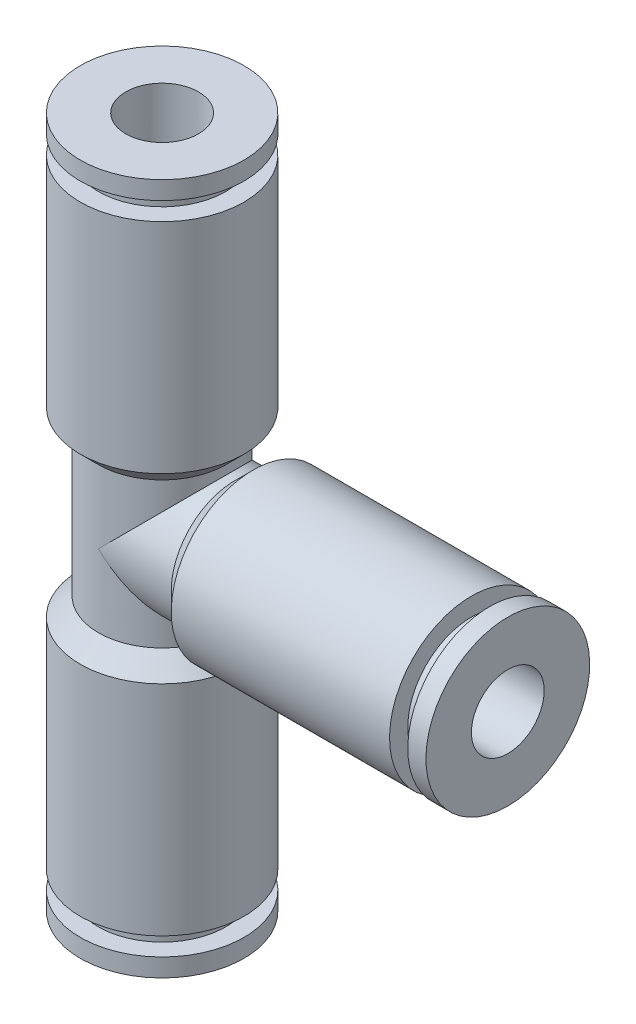
ISO-10303-21;
HEADER;
FILE_DESCRIPTION(('STEP AP214'),'2;1');
FILE_NAME('part.step','',(''),(''),'','','');
FILE_SCHEMA(('AUTOMOTIVE_DESIGN { 1 0 10303 214 1 1 1 1 }'));
ENDSEC;
DATA;
#1=APPLICATION_CONTEXT('core data for automotive mechanical design processes');
#2=APPLICATION_PROTOCOL_DEFINITION('international standard','automotive_design',2000,#1);
#3=PRODUCT_CONTEXT('',#1,'mechanical');
#4=PRODUCT('Part','Part','',(#3));
#5=PRODUCT_RELATED_PRODUCT_CATEGORY('part','',(#4));
#6=PRODUCT_DEFINITION_FORMATION('','',#4);
#7=PRODUCT_DEFINITION_CONTEXT('part definition',#1,'design');
#8=PRODUCT_DEFINITION('design','',#6,#7);
#9=PRODUCT_DEFINITION_SHAPE('','',#8);
#10=(LENGTH_UNIT() NAMED_UNIT(*) SI_UNIT(.MILLI.,.METRE.));
#11=(NAMED_UNIT(*) PLANE_ANGLE_UNIT() SI_UNIT($,.RADIAN.));
#12=(NAMED_UNIT(*) SI_UNIT($,.STERADIAN.) SOLID_ANGLE_UNIT());
#13=UNCERTAINTY_MEASURE_WITH_UNIT(LENGTH_MEASURE(1.E-05),#10,'distance_accuracy_value','');
#14=(GEOMETRIC_REPRESENTATION_CONTEXT(3) GLOBAL_UNCERTAINTY_ASSIGNED_CONTEXT((#13)) GLOBAL_UNIT_ASSIGNED_CONTEXT((#10,
#11,#12)) REPRESENTATION_CONTEXT('',''));
#15=CARTESIAN_POINT('',(0.,0.,0.));
#16=DIRECTION('',(0.,0.,1.));
#17=DIRECTION('',(1.,0.,0.));
#18=AXIS2_PLACEMENT_3D('',#15,#16,#17);
#19=CARTESIAN_POINT('',(0.,0.887308404943726,0.));
#20=DIRECTION('',(0.,-1.,0.));
#21=DIRECTION('',(1.,0.,0.));
#22=AXIS2_PLACEMENT_3D('',#19,#20,#21);
#23=CYLINDRICAL_SURFACE('',#22,2.);
#24=CARTESIAN_POINT('',(0.,19.,0.));
#25=DIRECTION('',(0.,-1.,0.));
#26=DIRECTION('',(1.,0.,0.));
#27=AXIS2_PLACEMENT_3D('',#24,#25,#26);
#28=CIRCLE('',#27,2.);
#29=CARTESIAN_POINT('',(2.,19.,0.));
#30=VERTEX_POINT('',#29);
#31=EDGE_CURVE('E84',#30,#30,#28,.T.);
#32=ORIENTED_EDGE('',*,*,#31,.F.);
#33=EDGE_LOOP('',(#32));
#34=FACE_BOUND('',#33,.T.);
#35=CARTESIAN_POINT('',(2.,3.49999999999999,0.));
#36=CARTESIAN_POINT('',(1.99999502725213,3.49999553497162,0.103121073276095));
#37=CARTESIAN_POINT('',(1.99196945368553,3.49539218804252,0.206418292241573));
#38=CARTESIAN_POINT('',(1.96025838229543,3.47741964792395,0.409938220573779));
#39=CARTESIAN_POINT('',(1.93653251819956,3.46402785992757,0.510152306170788));
#40=CARTESIAN_POINT('',(1.87470120206554,3.42984640883028,0.704136692781992));
#41=CARTESIAN_POINT('',(1.83666413455008,3.4090919539548,0.79793516993675));
#42=CARTESIAN_POINT('',(1.74769013430303,3.36199330055897,0.977566018148809));
#43=CARTESIAN_POINT('',(1.69675679592544,3.33565065986802,1.06340059975113));
#44=CARTESIAN_POINT('',(1.57931420254711,3.27741428654611,1.23168334606477));
#45=CARTESIAN_POINT('',(1.51194552690006,3.24525701136938,1.31343890348909));
#46=CARTESIAN_POINT('',(1.36544265813628,3.17964476042356,1.46516457042854));
#47=CARTESIAN_POINT('',(1.28629466837633,3.14618829739229,1.53512065191323));
#48=CARTESIAN_POINT('',(1.10830358077025,3.07747838735578,1.66894420512512));
#49=CARTESIAN_POINT('',(1.00825487214969,3.0424247888563,1.73132377325174));
#50=CARTESIAN_POINT('',(0.797049727904477,2.9791301999857,1.83811251873574));
#51=CARTESIAN_POINT('',(0.685910428990679,2.95087892262009,1.88254890095162));
#52=CARTESIAN_POINT('',(0.480854835647809,2.91092238783709,1.94359344806483));
#53=CARTESIAN_POINT('',(0.388568485825074,2.89693925602986,1.96418339921187));
#54=CARTESIAN_POINT('',(0.201150264306659,2.87781339076578,1.99210676207498));
#55=CARTESIAN_POINT('',(0.106021554363009,2.87266118113285,1.99945438414142));
#56=CARTESIAN_POINT('',(-0.0844746853087387,2.87194187276704,2.00048758468052));
#57=CARTESIAN_POINT('',(-0.179842363786533,2.87638786414303,1.99415450528781));
#58=CARTESIAN_POINT('',(-0.367902505186739,2.89422946937727,1.96816496378146));
#59=CARTESIAN_POINT('',(-0.460593081672933,2.90763124084925,1.94849933463808));
#60=CARTESIAN_POINT('',(-0.640664930319435,2.94153701353578,1.8969175277205));
#61=CARTESIAN_POINT('',(-0.728065335499013,2.9620133688412,1.86504898450024));
#62=CARTESIAN_POINT('',(-0.896549852677718,3.00785886649625,1.79016995537344));
#63=CARTESIAN_POINT('',(-0.977631532555185,3.03322987990245,1.74715520649774));
#64=CARTESIAN_POINT('',(-1.1449728953697,3.09092813712121,1.64323768381765));
#65=CARTESIAN_POINT('',(-1.22998014172812,3.12371858601076,1.5805729697491));
#66=CARTESIAN_POINT('',(-1.38908431950142,3.18971935679179,1.44275323922578));
#67=CARTESIAN_POINT('',(-1.46317184839194,3.22293001410095,1.36758757586109));
#68=CARTESIAN_POINT('',(-1.60682420141336,3.29050445602272,1.19664071603844));
#69=CARTESIAN_POINT('',(-1.67491295111796,3.32456879734035,1.09948658535069));
#70=CARTESIAN_POINT('',(-1.79350679145513,3.3858660255659,0.893015490655642));
#71=CARTESIAN_POINT('',(-1.8440229636514,3.41310321475137,0.783706249477131));
#72=CARTESIAN_POINT('',(-1.92218392422592,3.45598032097164,0.563793778179164));
#73=CARTESIAN_POINT('',(-1.95116821061519,3.47229170031822,0.453802193453642));
#74=CARTESIAN_POINT('',(-1.99003815887878,3.49427902499677,0.229493069556972));
#75=CARTESIAN_POINT('',(-1.9999426552334,3.49996545850226,0.115179910205489));
#76=CARTESIAN_POINT('',(-2.00005001113385,3.50003013582767,-0.0995234593134481));
#77=CARTESIAN_POINT('',(-1.99249646618427,3.49569611836472,-0.199920938989516));
#78=CARTESIAN_POINT('',(-1.96259942660487,3.47874174583056,-0.397754958971083));
#79=CARTESIAN_POINT('',(-1.94025567842609,3.46612124870397,-0.495191448486278));
#80=CARTESIAN_POINT('',(-1.88211536153291,3.43391644887746,-0.683570804723376));
#81=CARTESIAN_POINT('',(-1.84645909005903,3.41440488141579,-0.77457001301214));
#82=CARTESIAN_POINT('',(-1.76298426395287,3.36999496877883,-0.949355356164683));
#83=CARTESIAN_POINT('',(-1.71516278100544,3.34509532684398,-1.03313974782513));
#84=CARTESIAN_POINT('',(-1.60310615914213,3.28897467991618,-1.20050997117732));
#85=CARTESIAN_POINT('',(-1.5376806618373,3.25736546620183,-1.28316737085611));
#86=CARTESIAN_POINT('',(-1.3950383388772,3.19250590835506,-1.43697220197863));
#87=CARTESIAN_POINT('',(-1.31780802245904,3.15925371640031,-1.50810627029584));
#88=CARTESIAN_POINT('',(-1.14359747619123,3.09042173562361,-1.64492727997191));
#89=CARTESIAN_POINT('',(-1.0453752014078,3.05499597284182,-1.70912186715334));
#90=CARTESIAN_POINT('',(-0.837645368584615,2.99031347421968,-1.8199337629672));
#91=CARTESIAN_POINT('',(-0.728153057102536,2.96104856289278,-1.86657443137411));
#92=CARTESIAN_POINT('',(-0.524764735991298,2.91851233429598,-1.93222109228878));
#93=CARTESIAN_POINT('',(-0.432523508968215,2.90316105554951,-1.95499953445202));
#94=CARTESIAN_POINT('',(-0.244765907656737,2.88119032331328,-1.98724336712396));
#95=CARTESIAN_POINT('',(-0.149253387204231,2.87456093476639,-1.99672390601701));
#96=CARTESIAN_POINT('',(0.0425227698669268,2.87099312033822,-2.00185191685028));
#97=CARTESIAN_POINT('',(0.138787530545775,2.87407420528574,-1.99747153858607));
#98=CARTESIAN_POINT('',(0.32897715069236,2.8895014010665,-1.97508383758896));
#99=CARTESIAN_POINT('',(0.422900491394058,2.90185337180125,-1.95706789608754));
#100=CARTESIAN_POINT('',(0.604375633033563,2.93383807739165,-1.90877044170586));
#101=CARTESIAN_POINT('',(0.692009558249187,2.95334114102881,-1.87870654392501));
#102=CARTESIAN_POINT('',(0.861199095743589,2.99749553285303,-1.8074218972167));
#103=CARTESIAN_POINT('',(0.942752452421574,3.0221487587385,-1.7661970341072));
#104=CARTESIAN_POINT('',(1.11084333294311,3.0784352308926,-1.66643167949608));
#105=CARTESIAN_POINT('',(1.19621458045877,3.11055873295866,-1.60620233461966));
#106=CARTESIAN_POINT('',(1.35645763372194,3.1756273473033,-1.47338604433881));
#107=CARTESIAN_POINT('',(1.43132022710409,3.20857315102009,-1.40078837818174));
#108=CARTESIAN_POINT('',(1.57786072312091,3.27641810201074,-1.23454792336606));
#109=CARTESIAN_POINT('',(1.64798238220284,3.31104995544659,-1.13941038595581));
#110=CARTESIAN_POINT('',(1.77105878863118,3.37399623220538,-0.936681498761439));
#111=CARTESIAN_POINT('',(1.82402314759852,3.4023141898287,-0.829097167751354));
#112=CARTESIAN_POINT('',(1.90261714413287,3.4451526868773,-0.624382501194149));
#113=CARTESIAN_POINT('',(1.93143235098222,3.46123111271097,-0.528793868969383));
#114=CARTESIAN_POINT('',(1.97450218307986,3.48544612424224,-0.333572465521445));
#115=CARTESIAN_POINT('',(1.9887988704832,3.49360564902774,-0.233952251382031));
#116=CARTESIAN_POINT('',(1.99701217642184,3.49829363663155,-0.111553482810457));
#117=CARTESIAN_POINT('',(1.99813153012492,3.49893257713487,-0.0892655426398955));
#118=CARTESIAN_POINT('',(1.99962601938614,3.49978626453078,-0.0446544907868006));
#119=CARTESIAN_POINT('',(2.00000107687301,3.50000096692385,-0.0223313756604226));
#120=CARTESIAN_POINT('',(2.,3.49999999999999,0.));
#121=B_SPLINE_CURVE_WITH_KNOTS('',3,(#35,#36,#37,#38,#39,#40,#41,#42,#43,#44,#45,#46,#47,#48,
#49,#50,#51,#52,#53,#54,#55,#56,#57,#58,#59,#60,#61,#62,#63,#64,#65,#66,#67,#68,#69,#70,#71,#72,
#73,#74,#75,#76,#77,#78,#79,#80,#81,#82,#83,#84,#85,#86,#87,#88,#89,#90,#91,#92,#93,#94,#95,#96,
#97,#98,#99,#100,#101,#102,#103,#104,#105,#106,#107,#108,#109,#110,#111,#112,#113,#114,#115,
#116,#117,#118,#119,#120),.UNSPECIFIED.,.T.,.F.,(4,2,2,2,2,2,2,2,2,2,2,2,2,2,2,2,2,2,2,2,2,2,2,
2,2,2,2,2,2,2,2,2,2,2,2,2,2,2,2,2,2,2,4),(0.,0.309268603260588,0.619335457908361,
0.9279391304917,1.23645688582088,1.56726264134176,1.89845895106408,2.2656484043951,
2.63227902790326,2.91779157032785,3.2029975462506,3.48859273422686,3.77438448762791,
4.05907183070885,4.34386821620899,4.67430361887065,5.00502190433096,5.37340568410987,
5.74155673192309,6.08426181113763,6.42662841774189,6.72747548140296,7.028327702629,
7.32609492686909,7.62393389525625,7.95277463151787,8.28199402221958,8.64793130772769,
9.01337988790352,9.30087929443284,9.58805092761004,9.8757999297473,10.1637309643622,
10.4466801504154,10.7297337802306,11.0563737137124,11.3832982298872,11.7509152703936,
12.1183260120783,12.4204193511693,12.7216349655948,12.7886015789519,12.85557521625),.UNSPECIFIED.);
#122=CARTESIAN_POINT('',(0.,2.87228132326901,-2.));
#123=VERTEX_POINT('',#122);
#124=CARTESIAN_POINT('',(0.,2.87228132326901,2.));
#125=VERTEX_POINT('',#124);
#126=EDGE_CURVE('E91',#123,#125,#121,.T.);
#127=ORIENTED_EDGE('',*,*,#126,.T.);
#128=CARTESIAN_POINT('',(0.,2.87228132326901,0.));
#129=DIRECTION('',(0.,-1.,0.));
#130=DIRECTION('',(1.,0.,0.));
#131=AXIS2_PLACEMENT_3D('',#128,#129,#130);
#132=CIRCLE('',#131,2.);
#133=EDGE_CURVE('E438',#125,#123,#132,.T.);
#134=ORIENTED_EDGE('',*,*,#133,.T.);
#135=EDGE_LOOP('',(#127,#134));
#136=FACE_BOUND('',#135,.T.);
#137=ADVANCED_FACE('F41',(#34,#136),#23,.F.);
#138=CARTESIAN_POINT('',(0.,0.887308404943726,0.));
#139=DIRECTION('',(0.,-1.,0.));
#140=DIRECTION('',(1.,0.,0.));
#141=AXIS2_PLACEMENT_3D('',#138,#139,#140);
#142=CYLINDRICAL_SURFACE('',#141,3.5);
#143=CARTESIAN_POINT('',(0.,4.,0.));
#144=DIRECTION('',(0.,-1.,0.));
#145=DIRECTION('',(1.,0.,0.));
#146=AXIS2_PLACEMENT_3D('',#143,#144,#145);
#147=CIRCLE('',#146,3.5);
#148=CARTESIAN_POINT('',(3.5,4.,0.));
#149=VERTEX_POINT('',#148);
#150=EDGE_CURVE('E436',#149,#149,#147,.T.);
#151=ORIENTED_EDGE('',*,*,#150,.T.);
#152=EDGE_LOOP('',(#151));
#153=FACE_BOUND('',#152,.T.);
#154=CARTESIAN_POINT('',(0.,0.,0.));
#155=DIRECTION('',(0.707106781186546,-0.707106781186549,0.));
#156=DIRECTION('',(-0.707106781186549,-0.707106781186546,0.));
#157=AXIS2_PLACEMENT_3D('',#154,#155,#156);
#158=ELLIPSE('',#157,4.94974746830582,3.5);
#159=CARTESIAN_POINT('',(0.,0.,-3.5));
#160=VERTEX_POINT('',#159);
#161=CARTESIAN_POINT('',(0.,0.,3.5));
#162=VERTEX_POINT('',#161);
#163=EDGE_CURVE('E54',#160,#162,#158,.T.);
#164=ORIENTED_EDGE('',*,*,#163,.F.);
#165=CARTESIAN_POINT('',(0.,0.,0.));
#166=DIRECTION('',(-0.707106781186549,-0.707106781186546,0.));
#167=DIRECTION('',(-0.707106781186546,0.707106781186549,0.));
#168=AXIS2_PLACEMENT_3D('',#165,#166,#167);
#169=ELLIPSE('',#168,4.94974746830584,3.5);
#170=EDGE_CURVE('E82',#160,#162,#169,.T.);
#171=ORIENTED_EDGE('',*,*,#170,.T.);
#172=EDGE_LOOP('',(#164,#171));
#173=FACE_BOUND('',#172,.T.);
#174=CARTESIAN_POINT('',(0.,-4.,0.));
#175=DIRECTION('',(0.,1.,0.));
#176=DIRECTION('',(-1.,0.,0.));
#177=AXIS2_PLACEMENT_3D('',#174,#175,#176);
#178=CIRCLE('',#177,3.5);
#179=CARTESIAN_POINT('',(-3.5,-4.,0.));
#180=VERTEX_POINT('',#179);
#181=EDGE_CURVE('E498',#180,#180,#178,.T.);
#182=ORIENTED_EDGE('',*,*,#181,.T.);
#183=EDGE_LOOP('',(#182));
#184=FACE_BOUND('',#183,.T.);
#185=ADVANCED_FACE('F85',(#153,#173,#184),#142,.T.);
#186=CARTESIAN_POINT('',(0.,19.,0.));
#187=DIRECTION('',(0.,1.,0.));
#188=DIRECTION('',(-1.,0.,0.));
#189=AXIS2_PLACEMENT_3D('',#186,#187,#188);
#190=PLANE('',#189);
#191=ORIENTED_EDGE('',*,*,#31,.T.);
#192=EDGE_LOOP('',(#191));
#193=FACE_BOUND('',#192,.T.);
#194=CARTESIAN_POINT('',(0.,19.,0.));
#195=DIRECTION('',(0.,-1.,0.));
#196=DIRECTION('',(1.,0.,0.));
#197=AXIS2_PLACEMENT_3D('',#194,#195,#196);
#198=CIRCLE('',#197,4.5);
#199=CARTESIAN_POINT('',(4.5,19.,0.));
#200=VERTEX_POINT('',#199);
#201=EDGE_CURVE('E416',#200,#200,#198,.T.);
#202=ORIENTED_EDGE('',*,*,#201,.F.);
#203=EDGE_LOOP('',(#202));
#204=FACE_BOUND('',#203,.T.);
#205=ADVANCED_FACE('F156',(#193,#204),#190,.T.);
#206=CARTESIAN_POINT('',(0.,0.887308404943726,0.));
#207=DIRECTION('',(0.,-1.,0.));
#208=DIRECTION('',(1.,0.,0.));
#209=AXIS2_PLACEMENT_3D('',#206,#207,#208);
#210=CYLINDRICAL_SURFACE('',#209,4.5);
#211=CARTESIAN_POINT('',(0.,18.,0.));
#212=DIRECTION('',(0.,-1.,0.));
#213=DIRECTION('',(1.,0.,0.));
#214=AXIS2_PLACEMENT_3D('',#211,#212,#213);
#215=CIRCLE('',#214,4.5);
#216=CARTESIAN_POINT('',(4.5,18.,0.));
#217=VERTEX_POINT('',#216);
#218=EDGE_CURVE('E418',#217,#217,#215,.T.);
#219=ORIENTED_EDGE('',*,*,#218,.F.);
#220=EDGE_LOOP('',(#219));
#221=FACE_BOUND('',#220,.T.);
#222=ORIENTED_EDGE('',*,*,#201,.T.);
#223=EDGE_LOOP('',(#222));
#224=FACE_BOUND('',#223,.T.);
#225=ADVANCED_FACE('F383',(#221,#224),#210,.T.);
#226=CARTESIAN_POINT('',(0.,18.,0.));
#227=DIRECTION('',(0.,1.,0.));
#228=DIRECTION('',(-1.,0.,0.));
#229=AXIS2_PLACEMENT_3D('',#226,#227,#228);
#230=PLANE('',#229);
#231=CARTESIAN_POINT('',(0.,18.,0.));
#232=DIRECTION('',(0.,-1.,0.));
#233=DIRECTION('',(1.,0.,0.));
#234=AXIS2_PLACEMENT_3D('',#231,#232,#233);
#235=CIRCLE('',#234,3.5);
#236=CARTESIAN_POINT('',(3.5,18.,0.));
#237=VERTEX_POINT('',#236);
#238=EDGE_CURVE('E422',#237,#237,#235,.T.);
#239=ORIENTED_EDGE('',*,*,#238,.F.);
#240=EDGE_LOOP('',(#239));
#241=FACE_BOUND('',#240,.T.);
#242=ORIENTED_EDGE('',*,*,#218,.T.);
#243=EDGE_LOOP('',(#242));
#244=FACE_BOUND('',#243,.T.);
#245=ADVANCED_FACE('F372',(#241,#244),#230,.F.);
#246=CARTESIAN_POINT('',(0.,0.887308404943726,0.));
#247=DIRECTION('',(0.,-1.,0.));
#248=DIRECTION('',(1.,0.,0.));
#249=AXIS2_PLACEMENT_3D('',#246,#247,#248);
#250=CYLINDRICAL_SURFACE('',#249,3.5);
#251=ORIENTED_EDGE('',*,*,#238,.T.);
#252=EDGE_LOOP('',(#251));
#253=FACE_BOUND('',#252,.T.);
#254=CARTESIAN_POINT('',(0.,17.,0.));
#255=DIRECTION('',(0.,-1.,0.));
#256=DIRECTION('',(1.,0.,0.));
#257=AXIS2_PLACEMENT_3D('',#254,#255,#256);
#258=CIRCLE('',#257,3.5);
#259=CARTESIAN_POINT('',(3.5,17.,0.));
#260=VERTEX_POINT('',#259);
#261=EDGE_CURVE('E427',#260,#260,#258,.T.);
#262=ORIENTED_EDGE('',*,*,#261,.F.);
#263=EDGE_LOOP('',(#262));
#264=FACE_BOUND('',#263,.T.);
#265=ADVANCED_FACE('F362',(#253,#264),#250,.T.);
#266=CARTESIAN_POINT('',(0.,17.,0.));
#267=DIRECTION('',(0.,1.,0.));
#268=DIRECTION('',(-1.,0.,0.));
#269=AXIS2_PLACEMENT_3D('',#266,#267,#268);
#270=PLANE('',#269);
#271=ORIENTED_EDGE('',*,*,#261,.T.);
#272=EDGE_LOOP('',(#271));
#273=FACE_BOUND('',#272,.T.);
#274=CARTESIAN_POINT('',(0.,17.,0.));
#275=DIRECTION('',(0.,-1.,0.));
#276=DIRECTION('',(1.,0.,0.));
#277=AXIS2_PLACEMENT_3D('',#274,#275,#276);
#278=CIRCLE('',#277,4.5);
#279=CARTESIAN_POINT('',(4.5,17.,0.));
#280=VERTEX_POINT('',#279);
#281=EDGE_CURVE('E430',#280,#280,#278,.T.);
#282=ORIENTED_EDGE('',*,*,#281,.F.);
#283=EDGE_LOOP('',(#282));
#284=FACE_BOUND('',#283,.T.);
#285=ADVANCED_FACE('F352',(#273,#284),#270,.T.);
#286=CARTESIAN_POINT('',(0.,0.887308404943726,0.));
#287=DIRECTION('',(0.,-1.,0.));
#288=DIRECTION('',(1.,0.,0.));
#289=AXIS2_PLACEMENT_3D('',#286,#287,#288);
#290=CYLINDRICAL_SURFACE('',#289,4.5);
#291=ORIENTED_EDGE('',*,*,#281,.T.);
#292=EDGE_LOOP('',(#291));
#293=FACE_BOUND('',#292,.T.);
#294=CARTESIAN_POINT('',(0.,4.99999999999998,0.));
#295=DIRECTION('',(0.,-1.,0.));
#296=DIRECTION('',(1.,0.,0.));
#297=AXIS2_PLACEMENT_3D('',#294,#295,#296);
#298=CIRCLE('',#297,4.5);
#299=CARTESIAN_POINT('',(4.5,4.99999999999998,0.));
#300=VERTEX_POINT('',#299);
#301=EDGE_CURVE('E433',#300,#300,#298,.T.);
#302=ORIENTED_EDGE('',*,*,#301,.F.);
#303=EDGE_LOOP('',(#302));
#304=FACE_BOUND('',#303,.T.);
#305=ADVANCED_FACE('F342',(#293,#304),#290,.T.);
#306=CARTESIAN_POINT('',(0.,4.99999999999998,0.));
#307=DIRECTION('',(0.,1.,0.));
#308=DIRECTION('',(-1.,0.,0.));
#309=AXIS2_PLACEMENT_3D('',#306,#307,#308);
#310=CONICAL_SURFACE('',#309,4.5,0.78539816339746);
#311=ORIENTED_EDGE('',*,*,#150,.F.);
#312=EDGE_LOOP('',(#311));
#313=FACE_BOUND('',#312,.T.);
#314=ORIENTED_EDGE('',*,*,#301,.T.);
#315=EDGE_LOOP('',(#314));
#316=FACE_BOUND('',#315,.T.);
#317=ADVANCED_FACE('F318',(#313,#316),#310,.T.);
#318=CARTESIAN_POINT('',(0.887308404943726,0.,0.));
#319=DIRECTION('',(-1.,0.,0.));
#320=DIRECTION('',(0.,-1.,0.));
#321=AXIS2_PLACEMENT_3D('',#318,#319,#320);
#322=CYLINDRICAL_SURFACE('',#321,3.5);
#323=CARTESIAN_POINT('',(0.,0.,0.));
#324=DIRECTION('',(-1.,0.,0.));
#325=DIRECTION('',(0.,-1.,0.));
#326=AXIS2_PLACEMENT_3D('',#323,#324,#325);
#327=CIRCLE('',#326,3.5);
#328=CARTESIAN_POINT('',(0.,-2.87228132326901,-2.));
#329=VERTEX_POINT('',#328);
#330=CARTESIAN_POINT('',(0.,-2.87228132326901,2.));
#331=VERTEX_POINT('',#330);
#332=EDGE_CURVE('E60',#329,#331,#327,.T.);
#333=ORIENTED_EDGE('',*,*,#332,.F.);
#334=CARTESIAN_POINT('',(2.,-3.50000000000001,0.));
#335=CARTESIAN_POINT('',(1.99999502725213,-3.49999553497164,0.103121073276095));
#336=CARTESIAN_POINT('',(1.99196945368553,-3.49539218804253,0.206418292241572));
#337=CARTESIAN_POINT('',(1.96025838229543,-3.47741964792396,0.409938220573779));
#338=CARTESIAN_POINT('',(1.93653251819956,-3.46402785992759,0.510152306170787));
#339=CARTESIAN_POINT('',(1.87470120206554,-3.42984640883029,0.70413669278199));
#340=CARTESIAN_POINT('',(1.83666413455008,-3.40909195395481,0.797935169936748));
#341=CARTESIAN_POINT('',(1.74769013430304,-3.36199330055899,0.977566018148807));
#342=CARTESIAN_POINT('',(1.69675679592544,-3.33565065986803,1.06340059975112));
#343=CARTESIAN_POINT('',(1.57931420254712,-3.27741428654612,1.23168334606476));
#344=CARTESIAN_POINT('',(1.51194552690006,-3.2452570113694,1.31343890348909));
#345=CARTESIAN_POINT('',(1.36544265813628,-3.17964476042357,1.46516457042853));
#346=CARTESIAN_POINT('',(1.28629466837634,-3.1461882973923,1.53512065191323));
#347=CARTESIAN_POINT('',(1.10830358077026,-3.07747838735579,1.66894420512512));
#348=CARTESIAN_POINT('',(1.00825487214969,-3.04242478885631,1.73132377325174));
#349=CARTESIAN_POINT('',(0.797049727904481,-2.9791301999857,1.83811251873573));
#350=CARTESIAN_POINT('',(0.685910428990683,-2.9508789226201,1.88254890095162));
#351=CARTESIAN_POINT('',(0.480854835647813,-2.9109223878371,1.94359344806483));
#352=CARTESIAN_POINT('',(0.388568485825078,-2.89693925602986,1.96418339921187));
#353=CARTESIAN_POINT('',(0.201150264306662,-2.87781339076578,1.99210676207498));
#354=CARTESIAN_POINT('',(0.106021554363013,-2.87266118113285,1.99945438414142));
#355=CARTESIAN_POINT('',(-0.0844746853087356,-2.87194187276704,2.00048758468052));
#356=CARTESIAN_POINT('',(-0.17984236378653,-2.87638786414303,1.99415450528781));
#357=CARTESIAN_POINT('',(-0.367902505186737,-2.89422946937727,1.96816496378146));
#358=CARTESIAN_POINT('',(-0.460593081672931,-2.90763124084924,1.94849933463808));
#359=CARTESIAN_POINT('',(-0.640664930319433,-2.94153701353578,1.8969175277205));
#360=CARTESIAN_POINT('',(-0.728065335499012,-2.96201336884119,1.86504898450024));
#361=CARTESIAN_POINT('',(-0.896549852677717,-3.00785886649625,1.79016995537344));
#362=CARTESIAN_POINT('',(-0.977631532555183,-3.03322987990244,1.74715520649775));
#363=CARTESIAN_POINT('',(-1.1449728953697,-3.0909281371212,1.64323768381765));
#364=CARTESIAN_POINT('',(-1.22998014172812,-3.12371858601075,1.5805729697491));
#365=CARTESIAN_POINT('',(-1.38908431950142,-3.18971935679178,1.44275323922578));
#366=CARTESIAN_POINT('',(-1.46317184839194,-3.22293001410094,1.3675875758611));
#367=CARTESIAN_POINT('',(-1.60682420141336,-3.29050445602271,1.19664071603844));
#368=CARTESIAN_POINT('',(-1.67491295111796,-3.32456879734034,1.0994865853507));
#369=CARTESIAN_POINT('',(-1.79350679145513,-3.38586602556588,0.893015490655648));
#370=CARTESIAN_POINT('',(-1.8440229636514,-3.41310321475136,0.783706249477136));
#371=CARTESIAN_POINT('',(-1.92218392422592,-3.45598032097162,0.56379377817917));
#372=CARTESIAN_POINT('',(-1.95116821061519,-3.47229170031821,0.453802193453648));
#373=CARTESIAN_POINT('',(-1.99003815887877,-3.49427902499675,0.229493069556978));
#374=CARTESIAN_POINT('',(-1.9999426552334,-3.49996545850225,0.115179910205495));
#375=CARTESIAN_POINT('',(-2.00005001113385,-3.50003013582766,-0.0995234593134429));
#376=CARTESIAN_POINT('',(-1.99249646618427,-3.49569611836471,-0.199920938989511));
#377=CARTESIAN_POINT('',(-1.96259942660487,-3.47874174583055,-0.397754958971079));
#378=CARTESIAN_POINT('',(-1.94025567842609,-3.46612124870396,-0.495191448486274));
#379=CARTESIAN_POINT('',(-1.88211536153292,-3.43391644887745,-0.683570804723373));
#380=CARTESIAN_POINT('',(-1.84645909005904,-3.41440488141578,-0.774570013012137));
#381=CARTESIAN_POINT('',(-1.76298426395287,-3.36999496877882,-0.949355356164681));
#382=CARTESIAN_POINT('',(-1.71516278100544,-3.34509532684396,-1.03313974782512));
#383=CARTESIAN_POINT('',(-1.60310615914213,-3.28897467991617,-1.20050997117732));
#384=CARTESIAN_POINT('',(-1.5376806618373,-3.25736546620181,-1.28316737085611));
#385=CARTESIAN_POINT('',(-1.3950383388772,-3.19250590835505,-1.43697220197863));
#386=CARTESIAN_POINT('',(-1.31780802245904,-3.1592537164003,-1.50810627029584));
#387=CARTESIAN_POINT('',(-1.14359747619124,-3.09042173562361,-1.64492727997191));
#388=CARTESIAN_POINT('',(-1.0453752014078,-3.05499597284182,-1.70912186715334));
#389=CARTESIAN_POINT('',(-0.837645368584617,-2.99031347421968,-1.8199337629672));
#390=CARTESIAN_POINT('',(-0.728153057102538,-2.96104856289278,-1.86657443137411));
#391=CARTESIAN_POINT('',(-0.524764735991299,-2.91851233429598,-1.93222109228878));
#392=CARTESIAN_POINT('',(-0.432523508968217,-2.90316105554951,-1.95499953445202));
#393=CARTESIAN_POINT('',(-0.244765907656738,-2.88119032331328,-1.98724336712396));
#394=CARTESIAN_POINT('',(-0.149253387204232,-2.87456093476639,-1.99672390601701));
#395=CARTESIAN_POINT('',(0.0425227698669252,-2.87099312033822,-2.00185191685028));
#396=CARTESIAN_POINT('',(0.138787530545773,-2.87407420528574,-1.99747153858607));
#397=CARTESIAN_POINT('',(0.328977150692358,-2.8895014010665,-1.97508383758896));
#398=CARTESIAN_POINT('',(0.422900491394056,-2.90185337180125,-1.95706789608754));
#399=CARTESIAN_POINT('',(0.604375633033561,-2.93383807739166,-1.90877044170586));
#400=CARTESIAN_POINT('',(0.692009558249186,-2.95334114102881,-1.87870654392501));
#401=CARTESIAN_POINT('',(0.861199095743587,-2.99749553285304,-1.8074218972167));
#402=CARTESIAN_POINT('',(0.942752452421572,-3.02214875873851,-1.7661970341072));
#403=CARTESIAN_POINT('',(1.11084333294311,-3.07843523089261,-1.66643167949608));
#404=CARTESIAN_POINT('',(1.19621458045876,-3.11055873295866,-1.60620233461966));
#405=CARTESIAN_POINT('',(1.35645763372194,-3.17562734730331,-1.47338604433881));
#406=CARTESIAN_POINT('',(1.43132022710408,-3.2085731510201,-1.40078837818174));
#407=CARTESIAN_POINT('',(1.57786072312091,-3.27641810201075,-1.23454792336607));
#408=CARTESIAN_POINT('',(1.64798238220284,-3.3110499554466,-1.13941038595581));
#409=CARTESIAN_POINT('',(1.77105878863118,-3.37399623220539,-0.936681498761439));
#410=CARTESIAN_POINT('',(1.82402314759852,-3.40231418982871,-0.829097167751354));
#411=CARTESIAN_POINT('',(1.90261714413287,-3.44515268687731,-0.624382501194148));
#412=CARTESIAN_POINT('',(1.93143235098222,-3.46123111271098,-0.528793868969382));
#413=CARTESIAN_POINT('',(1.97450218307986,-3.48544612424225,-0.333572465521445));
#414=CARTESIAN_POINT('',(1.9887988704832,-3.49360564902776,-0.233952251382031));
#415=CARTESIAN_POINT('',(1.99701217642184,-3.49829363663156,-0.111553482810457));
#416=CARTESIAN_POINT('',(1.99813153012492,-3.49893257713489,-0.0892655426398946));
#417=CARTESIAN_POINT('',(1.99962601938614,-3.49978626453079,-0.0446544907867995));
#418=CARTESIAN_POINT('',(2.00000107687301,-3.50000096692386,-0.022331375660422));
#419=CARTESIAN_POINT('',(2.,-3.50000000000001,0.));
#420=B_SPLINE_CURVE_WITH_KNOTS('',3,(#334,#335,#336,#337,#338,#339,#340,#341,#342,#343,#344,
#345,#346,#347,#348,#349,#350,#351,#352,#353,#354,#355,#356,#357,#358,#359,#360,#361,#362,#363,
#364,#365,#366,#367,#368,#369,#370,#371,#372,#373,#374,#375,#376,#377,#378,#379,#380,#381,#382,
#383,#384,#385,#386,#387,#388,#389,#390,#391,#392,#393,#394,#395,#396,#397,#398,#399,#400,#401,
#402,#403,#404,#405,#406,#407,#408,#409,#410,#411,#412,#413,#414,#415,#416,#417,#418,#419),
.UNSPECIFIED.,.T.,.F.,(4,2,2,2,2,2,2,2,2,2,2,2,2,2,2,2,2,2,2,2,2,2,2,2,2,2,2,2,2,2,2,2,2,2,2,2,
2,2,2,2,2,2,4),(0.,0.309268603260587,0.61933545790836,0.927939130491698,1.23645688582088,
1.56726264134176,1.89845895106408,2.26564840439509,2.63227902790326,2.91779157032785,
3.2029975462506,3.48859273422686,3.77438448762791,4.05907183070885,4.34386821620898,
4.67430361887064,5.00502190433096,5.37340568410987,5.74155673192308,6.08426181113762,
6.42662841774188,6.72747548140296,7.02832770262899,7.32609492686908,7.62393389525625,
7.95277463151786,8.28199402221958,8.64793130772768,9.01337988790352,9.30087929443283,
9.58805092761003,9.8757999297473,10.1637309643622,10.4466801504154,10.7297337802306,
11.0563737137124,11.3832982298872,11.7509152703936,12.1183260120783,12.4204193511693,
12.7216349655948,12.7886015789519,12.85557521625),.UNSPECIFIED.);
#421=EDGE_CURVE('E87',#329,#331,#420,.T.);
#422=ORIENTED_EDGE('',*,*,#421,.T.);
#423=EDGE_LOOP('',(#333,#422));
#424=FACE_BOUND('',#423,.T.);
#425=ADVANCED_FACE('F108',(#424),#322,.T.);
#426=CARTESIAN_POINT('',(0.,-0.887308404943726,0.));
#427=DIRECTION('',(0.,1.,0.));
#428=DIRECTION('',(-1.,0.,0.));
#429=AXIS2_PLACEMENT_3D('',#426,#427,#428);
#430=CYLINDRICAL_SURFACE('',#429,2.);
#431=CARTESIAN_POINT('',(0.,-19.,0.));
#432=DIRECTION('',(0.,1.,0.));
#433=DIRECTION('',(-1.,0.,0.));
#434=AXIS2_PLACEMENT_3D('',#431,#432,#433);
#435=CIRCLE('',#434,2.);
#436=CARTESIAN_POINT('',(-2.,-19.,0.));
#437=VERTEX_POINT('',#436);
#438=EDGE_CURVE('E477',#437,#437,#435,.T.);
#439=ORIENTED_EDGE('',*,*,#438,.F.);
#440=EDGE_LOOP('',(#439));
#441=FACE_BOUND('',#440,.T.);
#442=CARTESIAN_POINT('',(0.,-2.87228132326901,0.));
#443=DIRECTION('',(0.,1.,0.));
#444=DIRECTION('',(-1.,0.,0.));
#445=AXIS2_PLACEMENT_3D('',#442,#443,#444);
#446=CIRCLE('',#445,2.);
#447=EDGE_CURVE('E446',#331,#329,#446,.F.);
#448=ORIENTED_EDGE('',*,*,#447,.F.);
#449=ORIENTED_EDGE('',*,*,#421,.F.);
#450=EDGE_LOOP('',(#448,#449));
#451=FACE_BOUND('',#450,.T.);
#452=ADVANCED_FACE('F111',(#441,#451),#430,.F.);
#453=CARTESIAN_POINT('',(0.,-19.,0.));
#454=DIRECTION('',(0.,-1.,0.));
#455=DIRECTION('',(1.,0.,0.));
#456=AXIS2_PLACEMENT_3D('',#453,#454,#455);
#457=PLANE('',#456);
#458=ORIENTED_EDGE('',*,*,#438,.T.);
#459=EDGE_LOOP('',(#458));
#460=FACE_BOUND('',#459,.T.);
#461=CARTESIAN_POINT('',(0.,-19.,0.));
#462=DIRECTION('',(0.,1.,0.));
#463=DIRECTION('',(-1.,0.,0.));
#464=AXIS2_PLACEMENT_3D('',#461,#462,#463);
#465=CIRCLE('',#464,4.5);
#466=CARTESIAN_POINT('',(-4.5,-19.,0.));
#467=VERTEX_POINT('',#466);
#468=EDGE_CURVE('E480',#467,#467,#465,.T.);
#469=ORIENTED_EDGE('',*,*,#468,.F.);
#470=EDGE_LOOP('',(#469));
#471=FACE_BOUND('',#470,.T.);
#472=ADVANCED_FACE('F115',(#460,#471),#457,.T.);
#473=CARTESIAN_POINT('',(0.,-0.887308404943726,0.));
#474=DIRECTION('',(0.,1.,0.));
#475=DIRECTION('',(-1.,0.,0.));
#476=AXIS2_PLACEMENT_3D('',#473,#474,#475);
#477=CYLINDRICAL_SURFACE('',#476,4.5);
#478=CARTESIAN_POINT('',(0.,-18.,0.));
#479=DIRECTION('',(0.,1.,0.));
#480=DIRECTION('',(-1.,0.,0.));
#481=AXIS2_PLACEMENT_3D('',#478,#479,#480);
#482=CIRCLE('',#481,4.5);
#483=CARTESIAN_POINT('',(-4.5,-18.,0.));
#484=VERTEX_POINT('',#483);
#485=EDGE_CURVE('E483',#484,#484,#482,.T.);
#486=ORIENTED_EDGE('',*,*,#485,.F.);
#487=EDGE_LOOP('',(#486));
#488=FACE_BOUND('',#487,.T.);
#489=ORIENTED_EDGE('',*,*,#468,.T.);
#490=EDGE_LOOP('',(#489));
#491=FACE_BOUND('',#490,.T.);
#492=ADVANCED_FACE('F119',(#488,#491),#477,.T.);
#493=CARTESIAN_POINT('',(0.,-18.,0.));
#494=DIRECTION('',(0.,-1.,0.));
#495=DIRECTION('',(1.,0.,0.));
#496=AXIS2_PLACEMENT_3D('',#493,#494,#495);
#497=PLANE('',#496);
#498=CARTESIAN_POINT('',(0.,-18.,0.));
#499=DIRECTION('',(0.,1.,0.));
#500=DIRECTION('',(-1.,0.,0.));
#501=AXIS2_PLACEMENT_3D('',#498,#499,#500);
#502=CIRCLE('',#501,3.5);
#503=CARTESIAN_POINT('',(-3.5,-18.,0.));
#504=VERTEX_POINT('',#503);
#505=EDGE_CURVE('E486',#504,#504,#502,.T.);
#506=ORIENTED_EDGE('',*,*,#505,.F.);
#507=EDGE_LOOP('',(#506));
#508=FACE_BOUND('',#507,.T.);
#509=ORIENTED_EDGE('',*,*,#485,.T.);
#510=EDGE_LOOP('',(#509));
#511=FACE_BOUND('',#510,.T.);
#512=ADVANCED_FACE('F123',(#508,#511),#497,.F.);
#513=CARTESIAN_POINT('',(0.,-0.887308404943726,0.));
#514=DIRECTION('',(0.,1.,0.));
#515=DIRECTION('',(-1.,0.,0.));
#516=AXIS2_PLACEMENT_3D('',#513,#514,#515);
#517=CYLINDRICAL_SURFACE('',#516,3.5);
#518=ORIENTED_EDGE('',*,*,#505,.T.);
#519=EDGE_LOOP('',(#518));
#520=FACE_BOUND('',#519,.T.);
#521=CARTESIAN_POINT('',(0.,-17.,0.));
#522=DIRECTION('',(0.,1.,0.));
#523=DIRECTION('',(-1.,0.,0.));
#524=AXIS2_PLACEMENT_3D('',#521,#522,#523);
#525=CIRCLE('',#524,3.5);
#526=CARTESIAN_POINT('',(-3.5,-17.,0.));
#527=VERTEX_POINT('',#526);
#528=EDGE_CURVE('E489',#527,#527,#525,.T.);
#529=ORIENTED_EDGE('',*,*,#528,.F.);
#530=EDGE_LOOP('',(#529));
#531=FACE_BOUND('',#530,.T.);
#532=ADVANCED_FACE('F127',(#520,#531),#517,.T.);
#533=CARTESIAN_POINT('',(0.,-17.,0.));
#534=DIRECTION('',(0.,-1.,0.));
#535=DIRECTION('',(1.,0.,0.));
#536=AXIS2_PLACEMENT_3D('',#533,#534,#535);
#537=PLANE('',#536);
#538=ORIENTED_EDGE('',*,*,#528,.T.);
#539=EDGE_LOOP('',(#538));
#540=FACE_BOUND('',#539,.T.);
#541=CARTESIAN_POINT('',(0.,-17.,0.));
#542=DIRECTION('',(0.,1.,0.));
#543=DIRECTION('',(-1.,0.,0.));
#544=AXIS2_PLACEMENT_3D('',#541,#542,#543);
#545=CIRCLE('',#544,4.5);
#546=CARTESIAN_POINT('',(-4.5,-17.,0.));
#547=VERTEX_POINT('',#546);
#548=EDGE_CURVE('E492',#547,#547,#545,.T.);
#549=ORIENTED_EDGE('',*,*,#548,.F.);
#550=EDGE_LOOP('',(#549));
#551=FACE_BOUND('',#550,.T.);
#552=ADVANCED_FACE('F131',(#540,#551),#537,.T.);
#553=CARTESIAN_POINT('',(0.,-0.887308404943726,0.));
#554=DIRECTION('',(0.,1.,0.));
#555=DIRECTION('',(-1.,0.,0.));
#556=AXIS2_PLACEMENT_3D('',#553,#554,#555);
#557=CYLINDRICAL_SURFACE('',#556,4.5);
#558=ORIENTED_EDGE('',*,*,#548,.T.);
#559=EDGE_LOOP('',(#558));
#560=FACE_BOUND('',#559,.T.);
#561=CARTESIAN_POINT('',(0.,-4.99999999999998,0.));
#562=DIRECTION('',(0.,1.,0.));
#563=DIRECTION('',(-1.,0.,0.));
#564=AXIS2_PLACEMENT_3D('',#561,#562,#563);
#565=CIRCLE('',#564,4.5);
#566=CARTESIAN_POINT('',(-4.5,-4.99999999999998,0.));
#567=VERTEX_POINT('',#566);
#568=EDGE_CURVE('E495',#567,#567,#565,.T.);
#569=ORIENTED_EDGE('',*,*,#568,.F.);
#570=EDGE_LOOP('',(#569));
#571=FACE_BOUND('',#570,.T.);
#572=ADVANCED_FACE('F135',(#560,#571),#557,.T.);
#573=CARTESIAN_POINT('',(0.,-4.99999999999998,0.));
#574=DIRECTION('',(0.,-1.,0.));
#575=DIRECTION('',(1.,0.,0.));
#576=AXIS2_PLACEMENT_3D('',#573,#574,#575);
#577=CONICAL_SURFACE('',#576,4.5,0.78539816339746);
#578=ORIENTED_EDGE('',*,*,#181,.F.);
#579=EDGE_LOOP('',(#578));
#580=FACE_BOUND('',#579,.T.);
#581=ORIENTED_EDGE('',*,*,#568,.T.);
#582=EDGE_LOOP('',(#581));
#583=FACE_BOUND('',#582,.T.);
#584=ADVANCED_FACE('F139',(#580,#583),#577,.T.);
#585=CARTESIAN_POINT('',(4.99999999999998,0.,0.));
#586=DIRECTION('',(1.,0.,0.));
#587=DIRECTION('',(0.,1.,0.));
#588=AXIS2_PLACEMENT_3D('',#585,#586,#587);
#589=CONICAL_SURFACE('',#588,4.5,0.78539816339746);
#590=CARTESIAN_POINT('',(4.,0.,0.));
#591=DIRECTION('',(-1.,0.,0.));
#592=DIRECTION('',(0.,-1.,0.));
#593=AXIS2_PLACEMENT_3D('',#590,#591,#592);
#594=CIRCLE('',#593,3.5);
#595=CARTESIAN_POINT('',(3.99999999999999,-3.50000000000001,0.));
#596=VERTEX_POINT('',#595);
#597=EDGE_CURVE('E441',#596,#596,#594,.T.);
#598=ORIENTED_EDGE('',*,*,#597,.F.);
#599=EDGE_LOOP('',(#598));
#600=FACE_BOUND('',#599,.T.);
#601=CARTESIAN_POINT('',(4.99999999999998,0.,0.));
#602=DIRECTION('',(-1.,0.,0.));
#603=DIRECTION('',(0.,-1.,0.));
#604=AXIS2_PLACEMENT_3D('',#601,#602,#603);
#605=CIRCLE('',#604,4.5);
#606=CARTESIAN_POINT('',(4.99999999999996,-4.50000000000002,0.));
#607=VERTEX_POINT('',#606);
#608=EDGE_CURVE('E444',#607,#607,#605,.T.);
#609=ORIENTED_EDGE('',*,*,#608,.T.);
#610=EDGE_LOOP('',(#609));
#611=FACE_BOUND('',#610,.T.);
#612=ADVANCED_FACE('F142',(#600,#611),#589,.T.);
#613=CARTESIAN_POINT('',(0.887308404943726,0.,0.));
#614=DIRECTION('',(-1.,0.,0.));
#615=DIRECTION('',(0.,-1.,0.));
#616=AXIS2_PLACEMENT_3D('',#613,#614,#615);
#617=CYLINDRICAL_SURFACE('',#616,4.5);
#618=CARTESIAN_POINT('',(17.,0.,0.));
#619=DIRECTION('',(-1.,0.,0.));
#620=DIRECTION('',(0.,-1.,0.));
#621=AXIS2_PLACEMENT_3D('',#618,#619,#620);
#622=CIRCLE('',#621,4.5);
#623=CARTESIAN_POINT('',(17.,-4.50000000000006,0.));
#624=VERTEX_POINT('',#623);
#625=EDGE_CURVE('E452',#624,#624,#622,.T.);
#626=ORIENTED_EDGE('',*,*,#625,.T.);
#627=EDGE_LOOP('',(#626));
#628=FACE_BOUND('',#627,.T.);
#629=ORIENTED_EDGE('',*,*,#608,.F.);
#630=EDGE_LOOP('',(#629));
#631=FACE_BOUND('',#630,.T.);
#632=ADVANCED_FACE('F147',(#628,#631),#617,.T.);
#633=CARTESIAN_POINT('',(17.,0.,0.));
#634=DIRECTION('',(1.,0.,0.));
#635=DIRECTION('',(0.,1.,0.));
#636=AXIS2_PLACEMENT_3D('',#633,#634,#635);
#637=PLANE('',#636);
#638=CARTESIAN_POINT('',(17.,0.,0.));
#639=DIRECTION('',(-1.,0.,0.));
#640=DIRECTION('',(0.,-1.,0.));
#641=AXIS2_PLACEMENT_3D('',#638,#639,#640);
#642=CIRCLE('',#641,3.5);
#643=CARTESIAN_POINT('',(17.,-3.50000000000006,0.));
#644=VERTEX_POINT('',#643);
#645=EDGE_CURVE('E455',#644,#644,#642,.T.);
#646=ORIENTED_EDGE('',*,*,#645,.T.);
#647=EDGE_LOOP('',(#646));
#648=FACE_BOUND('',#647,.T.);
#649=ORIENTED_EDGE('',*,*,#625,.F.);
#650=EDGE_LOOP('',(#649));
#651=FACE_BOUND('',#650,.T.);
#652=ADVANCED_FACE('F242',(#648,#651),#637,.T.);
#653=CARTESIAN_POINT('',(0.887308404943726,0.,0.));
#654=DIRECTION('',(-1.,0.,0.));
#655=DIRECTION('',(0.,-1.,0.));
#656=AXIS2_PLACEMENT_3D('',#653,#654,#655);
#657=CYLINDRICAL_SURFACE('',#656,3.5);
#658=CARTESIAN_POINT('',(18.,0.,0.));
#659=DIRECTION('',(-1.,0.,0.));
#660=DIRECTION('',(0.,-1.,0.));
#661=AXIS2_PLACEMENT_3D('',#658,#659,#660);
#662=CIRCLE('',#661,3.5);
#663=CARTESIAN_POINT('',(18.,-3.50000000000006,0.));
#664=VERTEX_POINT('',#663);
#665=EDGE_CURVE('E458',#664,#664,#662,.T.);
#666=ORIENTED_EDGE('',*,*,#665,.T.);
#667=EDGE_LOOP('',(#666));
#668=FACE_BOUND('',#667,.T.);
#669=ORIENTED_EDGE('',*,*,#645,.F.);
#670=EDGE_LOOP('',(#669));
#671=FACE_BOUND('',#670,.T.);
#672=ADVANCED_FACE('F234',(#668,#671),#657,.T.);
#673=CARTESIAN_POINT('',(18.,0.,0.));
#674=DIRECTION('',(1.,0.,0.));
#675=DIRECTION('',(0.,1.,0.));
#676=AXIS2_PLACEMENT_3D('',#673,#674,#675);
#677=PLANE('',#676);
#678=ORIENTED_EDGE('',*,*,#665,.F.);
#679=EDGE_LOOP('',(#678));
#680=FACE_BOUND('',#679,.T.);
#681=CARTESIAN_POINT('',(18.,0.,0.));
#682=DIRECTION('',(-1.,0.,0.));
#683=DIRECTION('',(0.,-1.,0.));
#684=AXIS2_PLACEMENT_3D('',#681,#682,#683);
#685=CIRCLE('',#684,4.5);
#686=CARTESIAN_POINT('',(18.,-4.50000000000006,0.));
#687=VERTEX_POINT('',#686);
#688=EDGE_CURVE('E461',#687,#687,#685,.T.);
#689=ORIENTED_EDGE('',*,*,#688,.T.);
#690=EDGE_LOOP('',(#689));
#691=FACE_BOUND('',#690,.T.);
#692=ADVANCED_FACE('F225',(#680,#691),#677,.F.);
#693=CARTESIAN_POINT('',(0.887308404943726,0.,0.));
#694=DIRECTION('',(-1.,0.,0.));
#695=DIRECTION('',(0.,-1.,0.));
#696=AXIS2_PLACEMENT_3D('',#693,#694,#695);
#697=CYLINDRICAL_SURFACE('',#696,4.5);
#698=ORIENTED_EDGE('',*,*,#688,.F.);
#699=EDGE_LOOP('',(#698));
#700=FACE_BOUND('',#699,.T.);
#701=CARTESIAN_POINT('',(19.,0.,0.));
#702=DIRECTION('',(-1.,0.,0.));
#703=DIRECTION('',(0.,-1.,0.));
#704=AXIS2_PLACEMENT_3D('',#701,#702,#703);
#705=CIRCLE('',#704,4.5);
#706=CARTESIAN_POINT('',(19.,-4.50000000000007,0.));
#707=VERTEX_POINT('',#706);
#708=EDGE_CURVE('E94',#707,#707,#705,.T.);
#709=ORIENTED_EDGE('',*,*,#708,.T.);
#710=EDGE_LOOP('',(#709));
#711=FACE_BOUND('',#710,.T.);
#712=ADVANCED_FACE('F217',(#700,#711),#697,.T.);
#713=CARTESIAN_POINT('',(19.,0.,0.));
#714=DIRECTION('',(1.,0.,0.));
#715=DIRECTION('',(0.,1.,0.));
#716=AXIS2_PLACEMENT_3D('',#713,#714,#715);
#717=PLANE('',#716);
#718=CARTESIAN_POINT('',(19.,0.,0.));
#719=DIRECTION('',(-1.,0.,0.));
#720=DIRECTION('',(0.,-1.,0.));
#721=AXIS2_PLACEMENT_3D('',#718,#719,#720);
#722=CIRCLE('',#721,2.);
#723=CARTESIAN_POINT('',(19.,-2.00000000000007,0.));
#724=VERTEX_POINT('',#723);
#725=EDGE_CURVE('E88',#724,#724,#722,.T.);
#726=ORIENTED_EDGE('',*,*,#725,.T.);
#727=EDGE_LOOP('',(#726));
#728=FACE_BOUND('',#727,.T.);
#729=ORIENTED_EDGE('',*,*,#708,.F.);
#730=EDGE_LOOP('',(#729));
#731=FACE_BOUND('',#730,.T.);
#732=ADVANCED_FACE('F209',(#728,#731),#717,.T.);
#733=ORIENTED_EDGE('',*,*,#597,.T.);
#734=EDGE_LOOP('',(#733));
#735=FACE_BOUND('',#734,.T.);
#736=ORIENTED_EDGE('',*,*,#170,.F.);
#737=ORIENTED_EDGE('',*,*,#163,.T.);
#738=EDGE_LOOP('',(#736,#737));
#739=FACE_BOUND('',#738,.T.);
#740=ADVANCED_FACE('F81',(#735,#739),#322,.T.);
#741=CARTESIAN_POINT('',(0.887308404943726,0.,0.));
#742=DIRECTION('',(-1.,0.,0.));
#743=DIRECTION('',(0.,-1.,0.));
#744=AXIS2_PLACEMENT_3D('',#741,#742,#743);
#745=CYLINDRICAL_SURFACE('',#744,2.);
#746=ORIENTED_EDGE('',*,*,#725,.F.);
#747=EDGE_LOOP('',(#746));
#748=FACE_BOUND('',#747,.T.);
#749=CARTESIAN_POINT('',(3.5,1.99999999999999,0.));
#750=CARTESIAN_POINT('',(3.49999553497163,1.99999502725212,0.103121073276095));
#751=CARTESIAN_POINT('',(3.49539218804252,1.99196945368552,0.206418292241573));
#752=CARTESIAN_POINT('',(3.47741964792396,1.96025838229542,0.409938220573779));
#753=CARTESIAN_POINT('',(3.46402785992758,1.93653251819954,0.510152306170788));
#754=CARTESIAN_POINT('',(3.42984640883029,1.87470120206553,0.704136692781992));
#755=CARTESIAN_POINT('',(3.40909195395481,1.83666413455007,0.79793516993675));
#756=CARTESIAN_POINT('',(3.36199330055898,1.74769013430302,0.977566018148809));
#757=CARTESIAN_POINT('',(3.33565065986802,1.69675679592543,1.06340059975113));
#758=CARTESIAN_POINT('',(3.27741428654611,1.5793142025471,1.23168334606477));
#759=CARTESIAN_POINT('',(3.24525701136939,1.51194552690005,1.31343890348909));
#760=CARTESIAN_POINT('',(3.17964476042357,1.36544265813627,1.46516457042854));
#761=CARTESIAN_POINT('',(3.14618829739229,1.28629466837632,1.53512065191323));
#762=CARTESIAN_POINT('',(3.07747838735578,1.10830358077024,1.66894420512512));
#763=CARTESIAN_POINT('',(3.04242478885631,1.00825487214968,1.73132377325174));
#764=CARTESIAN_POINT('',(2.9791301999857,0.797049727904466,1.83811251873574));
#765=CARTESIAN_POINT('',(2.95087892262009,0.685910428990668,1.88254890095162));
#766=CARTESIAN_POINT('',(2.9109223878371,0.480854835647798,1.94359344806483));
#767=CARTESIAN_POINT('',(2.89693925602986,0.388568485825064,1.96418339921187));
#768=CARTESIAN_POINT('',(2.87781339076578,0.201150264306648,1.99210676207498));
#769=CARTESIAN_POINT('',(2.87266118113285,0.106021554363,1.99945438414142));
#770=CARTESIAN_POINT('',(2.87194187276704,-0.0844746853087484,2.00048758468052));
#771=CARTESIAN_POINT('',(2.87638786414303,-0.179842363786542,1.99415450528781));
#772=CARTESIAN_POINT('',(2.89422946937727,-0.367902505186748,1.96816496378146));
#773=CARTESIAN_POINT('',(2.90763124084925,-0.460593081672943,1.94849933463808));
#774=CARTESIAN_POINT('',(2.94153701353578,-0.640664930319445,1.8969175277205));
#775=CARTESIAN_POINT('',(2.9620133688412,-0.728065335499023,1.86504898450024));
#776=CARTESIAN_POINT('',(3.00785886649625,-0.896549852677728,1.79016995537344));
#777=CARTESIAN_POINT('',(3.03322987990244,-0.977631532555195,1.74715520649774));
#778=CARTESIAN_POINT('',(3.09092813712121,-1.14497289536971,1.64323768381765));
#779=CARTESIAN_POINT('',(3.12371858601075,-1.22998014172813,1.5805729697491));
#780=CARTESIAN_POINT('',(3.18971935679179,-1.38908431950143,1.44275323922578));
#781=CARTESIAN_POINT('',(3.22293001410094,-1.46317184839195,1.36758757586109));
#782=CARTESIAN_POINT('',(3.29050445602272,-1.60682420141337,1.19664071603844));
#783=CARTESIAN_POINT('',(3.32456879734034,-1.67491295111797,1.09948658535069));
#784=CARTESIAN_POINT('',(3.38586602556589,-1.79350679145515,0.893015490655642));
#785=CARTESIAN_POINT('',(3.41310321475137,-1.84402296365141,0.783706249477131));
#786=CARTESIAN_POINT('',(3.45598032097163,-1.92218392422593,0.563793778179165));
#787=CARTESIAN_POINT('',(3.47229170031822,-1.9511682106152,0.453802193453643));
#788=CARTESIAN_POINT('',(3.49427902499676,-1.99003815887879,0.229493069556973));
#789=CARTESIAN_POINT('',(3.49996545850225,-1.99994265523341,0.11517991020549));
#790=CARTESIAN_POINT('',(3.50003013582766,-2.00005001113386,-0.0995234593134473));
#791=CARTESIAN_POINT('',(3.49569611836472,-1.99249646618428,-0.199920938989515));
#792=CARTESIAN_POINT('',(3.47874174583055,-1.96259942660488,-0.397754958971082));
#793=CARTESIAN_POINT('',(3.46612124870397,-1.9402556784261,-0.495191448486277));
#794=CARTESIAN_POINT('',(3.43391644887745,-1.88211536153293,-0.683570804723376));
#795=CARTESIAN_POINT('',(3.41440488141578,-1.84645909005905,-0.77457001301214));
#796=CARTESIAN_POINT('',(3.36999496877882,-1.76298426395288,-0.949355356164683));
#797=CARTESIAN_POINT('',(3.34509532684397,-1.71516278100545,-1.03313974782513));
#798=CARTESIAN_POINT('',(3.28897467991617,-1.60310615914214,-1.20050997117732));
#799=CARTESIAN_POINT('',(3.25736546620182,-1.53768066183731,-1.28316737085611));
#800=CARTESIAN_POINT('',(3.19250590835506,-1.39503833887721,-1.43697220197863));
#801=CARTESIAN_POINT('',(3.15925371640031,-1.31780802245905,-1.50810627029584));
#802=CARTESIAN_POINT('',(3.09042173562361,-1.14359747619124,-1.64492727997191));
#803=CARTESIAN_POINT('',(3.05499597284182,-1.04537520140781,-1.70912186715334));
#804=CARTESIAN_POINT('',(2.99031347421968,-0.837645368584626,-1.8199337629672));
#805=CARTESIAN_POINT('',(2.96104856289278,-0.728153057102547,-1.86657443137411));
#806=CARTESIAN_POINT('',(2.91851233429598,-0.524764735991308,-1.93222109228878));
#807=CARTESIAN_POINT('',(2.90316105554951,-0.432523508968225,-1.95499953445202));
#808=CARTESIAN_POINT('',(2.88119032331328,-0.244765907656747,-1.98724336712396));
#809=CARTESIAN_POINT('',(2.87456093476639,-0.149253387204241,-1.99672390601701));
#810=CARTESIAN_POINT('',(2.87099312033822,0.0425227698669166,-2.00185191685028));
#811=CARTESIAN_POINT('',(2.87407420528574,0.138787530545765,-1.99747153858607));
#812=CARTESIAN_POINT('',(2.8895014010665,0.328977150692351,-1.97508383758896));
#813=CARTESIAN_POINT('',(2.90185337180125,0.422900491394048,-1.95706789608754));
#814=CARTESIAN_POINT('',(2.93383807739165,0.604375633033552,-1.90877044170586));
#815=CARTESIAN_POINT('',(2.95334114102881,0.692009558249177,-1.87870654392501));
#816=CARTESIAN_POINT('',(2.99749553285303,0.861199095743578,-1.8074218972167));
#817=CARTESIAN_POINT('',(3.02214875873851,0.942752452421563,-1.7661970341072));
#818=CARTESIAN_POINT('',(3.0784352308926,1.1108433329431,-1.66643167949608));
#819=CARTESIAN_POINT('',(3.11055873295866,1.19621458045875,-1.60620233461966));
#820=CARTESIAN_POINT('',(3.17562734730331,1.35645763372193,-1.47338604433881));
#821=CARTESIAN_POINT('',(3.20857315102009,1.43132022710407,-1.40078837818174));
#822=CARTESIAN_POINT('',(3.27641810201075,1.5778607231209,-1.23454792336607));
#823=CARTESIAN_POINT('',(3.31104995544659,1.64798238220283,-1.13941038595581));
#824=CARTESIAN_POINT('',(3.37399623220538,1.77105878863116,-0.936681498761439));
#825=CARTESIAN_POINT('',(3.4023141898287,1.82402314759851,-0.829097167751355));
#826=CARTESIAN_POINT('',(3.44515268687731,1.90261714413286,-0.624382501194149));
#827=CARTESIAN_POINT('',(3.46123111271098,1.93143235098221,-0.528793868969383));
#828=CARTESIAN_POINT('',(3.48544612424224,1.97450218307985,-0.333572465521445));
#829=CARTESIAN_POINT('',(3.49360564902775,1.98879887048319,-0.233952251382031));
#830=CARTESIAN_POINT('',(3.49829363663156,1.99701217642182,-0.111553482810458));
#831=CARTESIAN_POINT('',(3.49893257713488,1.9981315301249,-0.0892655426398958));
#832=CARTESIAN_POINT('',(3.49978626453079,1.99962601938613,-0.0446544907868007));
#833=CARTESIAN_POINT('',(3.50000096692385,2.000001076873,-0.0223313756604226));
#834=CARTESIAN_POINT('',(3.5,1.99999999999999,0.));
#835=B_SPLINE_CURVE_WITH_KNOTS('',3,(#749,#750,#751,#752,#753,#754,#755,#756,#757,#758,#759,
#760,#761,#762,#763,#764,#765,#766,#767,#768,#769,#770,#771,#772,#773,#774,#775,#776,#777,#778,
#779,#780,#781,#782,#783,#784,#785,#786,#787,#788,#789,#790,#791,#792,#793,#794,#795,#796,#797,
#798,#799,#800,#801,#802,#803,#804,#805,#806,#807,#808,#809,#810,#811,#812,#813,#814,#815,#816,
#817,#818,#819,#820,#821,#822,#823,#824,#825,#826,#827,#828,#829,#830,#831,#832,#833,#834),
.UNSPECIFIED.,.T.,.F.,(4,2,2,2,2,2,2,2,2,2,2,2,2,2,2,2,2,2,2,2,2,2,2,2,2,2,2,2,2,2,2,2,2,2,2,2,
2,2,2,2,2,2,4),(0.,0.309268603260588,0.619335457908361,0.9279391304917,1.23645688582088,
1.56726264134176,1.89845895106408,2.2656484043951,2.63227902790326,2.91779157032785,
3.2029975462506,3.48859273422686,3.77438448762791,4.05907183070885,4.34386821620898,
4.67430361887065,5.00502190433096,5.37340568410987,5.74155673192308,6.08426181113763,
6.42662841774189,6.72747548140296,7.028327702629,7.32609492686909,7.62393389525625,
7.95277463151787,8.28199402221958,8.64793130772769,9.01337988790352,9.30087929443284,
9.58805092761003,9.8757999297473,10.1637309643622,10.4466801504154,10.7297337802306,
11.0563737137124,11.3832982298872,11.7509152703936,12.1183260120783,12.4204193511693,
12.7216349655948,12.7886015789519,12.85557521625),.UNSPECIFIED.);
#836=CARTESIAN_POINT('',(3.5,1.99999999999999,0.));
#837=VERTEX_POINT('',#836);
#838=EDGE_CURVE('E11',#837,#837,#835,.T.);
#839=ORIENTED_EDGE('',*,*,#838,.F.);
#840=EDGE_LOOP('',(#839));
#841=FACE_BOUND('',#840,.T.);
#842=ADVANCED_FACE('F195',(#748,#841),#745,.F.);
#843=ORIENTED_EDGE('',*,*,#838,.T.);
#844=EDGE_LOOP('',(#843));
#845=FACE_BOUND('',#844,.T.);
#846=ADVANCED_FACE('F158',(#845),#142,.T.);
#847=CARTESIAN_POINT('',(0.,0.,0.));
#848=DIRECTION('',(-1.,0.,0.));
#849=DIRECTION('',(0.,1.,0.));
#850=AXIS2_PLACEMENT_3D('',#847,#848,#849);
#851=SPHERICAL_SURFACE('',#850,3.5);
#852=ORIENTED_EDGE('',*,*,#133,.F.);
#853=EDGE_CURVE('E67',#125,#123,#327,.T.);
#854=ORIENTED_EDGE('',*,*,#853,.T.);
#855=EDGE_LOOP('',(#852,#854));
#856=FACE_BOUND('',#855,.T.);
#857=ADVANCED_FACE('F182',(#856),#851,.T.);
#858=ORIENTED_EDGE('',*,*,#126,.F.);
#859=ORIENTED_EDGE('',*,*,#853,.F.);
#860=EDGE_LOOP('',(#858,#859));
#861=FACE_BOUND('',#860,.T.);
#862=ADVANCED_FACE('F176',(#861),#322,.T.);
#863=CARTESIAN_POINT('',(0.,0.,0.));
#864=DIRECTION('',(0.,-1.,0.));
#865=DIRECTION('',(-1.,0.,0.));
#866=AXIS2_PLACEMENT_3D('',#863,#864,#865);
#867=SPHERICAL_SURFACE('',#866,3.5);
#868=ORIENTED_EDGE('',*,*,#332,.T.);
#869=ORIENTED_EDGE('',*,*,#447,.T.);
#870=EDGE_LOOP('',(#868,#869));
#871=FACE_BOUND('',#870,.T.);
#872=ADVANCED_FACE('F43',(#871),#867,.T.);
#873=CLOSED_SHELL('',(#137,#185,#205,#225,#245,#265,#285,#305,#317,#425,#452,#472,#492,#512,
#532,#552,#572,#584,#612,#632,#652,#672,#692,#712,#732,#740,#842,#846,#857,#862,#872));
#874=CARTESIAN_POINT('',(0.,0.,0.));
#875=DIRECTION('',(0.,-1.,0.));
#876=DIRECTION('',(-1.,0.,0.));
#877=AXIS2_PLACEMENT_3D('',#874,#875,#876);
#878=SPHERICAL_SURFACE('',#877,2.);
#879=CARTESIAN_POINT('',(0.,-2.,0.));
#880=VERTEX_POINT('',#879);
#881=VERTEX_LOOP('',#880);
#882=FACE_BOUND('',#881,.T.);
#883=ADVANCED_FACE('F164',(#882),#878,.F.);
#884=CLOSED_SHELL('',(#883));
#885=ORIENTED_CLOSED_SHELL('',*,#884,.T.);
#886=BREP_WITH_VOIDS('B2',#873,(#885));
#887=ADVANCED_BREP_SHAPE_REPRESENTATION('',(#18,#886),#14);
#888=SHAPE_DEFINITION_REPRESENTATION(#9,#887);
ENDSEC;
END-ISO-10303-21;
